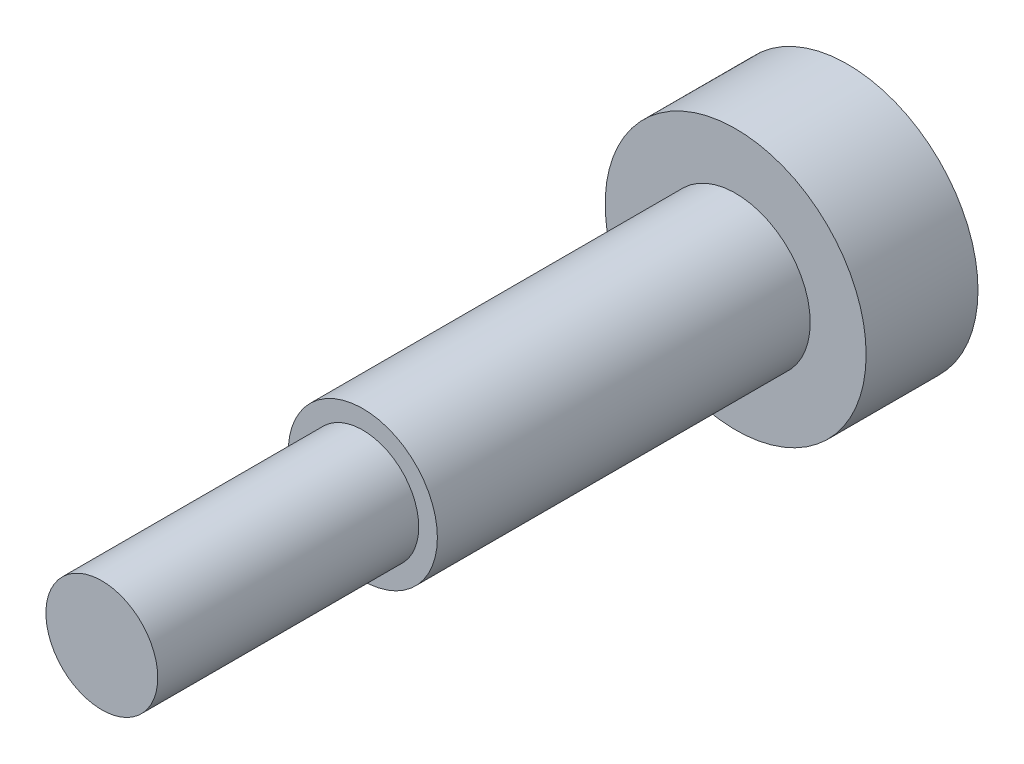
ISO-10303-21;
HEADER;
FILE_DESCRIPTION(('STEP AP214'),'2;1');
FILE_NAME('part.step','',(''),(''),'','','');
FILE_SCHEMA(('AUTOMOTIVE_DESIGN { 1 0 10303 214 1 1 1 1 }'));
ENDSEC;
DATA;
#1=APPLICATION_CONTEXT('core data for automotive mechanical design processes');
#2=APPLICATION_PROTOCOL_DEFINITION('international standard','automotive_design',2000,#1);
#3=PRODUCT_CONTEXT('',#1,'mechanical');
#4=PRODUCT('Part','Part','',(#3));
#5=PRODUCT_RELATED_PRODUCT_CATEGORY('part','',(#4));
#6=PRODUCT_DEFINITION_FORMATION('','',#4);
#7=PRODUCT_DEFINITION_CONTEXT('part definition',#1,'design');
#8=PRODUCT_DEFINITION('design','',#6,#7);
#9=PRODUCT_DEFINITION_SHAPE('','',#8);
#10=(LENGTH_UNIT() NAMED_UNIT(*) SI_UNIT(.MILLI.,.METRE.));
#11=(NAMED_UNIT(*) PLANE_ANGLE_UNIT() SI_UNIT($,.RADIAN.));
#12=(NAMED_UNIT(*) SI_UNIT($,.STERADIAN.) SOLID_ANGLE_UNIT());
#13=UNCERTAINTY_MEASURE_WITH_UNIT(LENGTH_MEASURE(1.E-05),#10,'distance_accuracy_value','');
#14=(GEOMETRIC_REPRESENTATION_CONTEXT(3) GLOBAL_UNCERTAINTY_ASSIGNED_CONTEXT((#13)) GLOBAL_UNIT_ASSIGNED_CONTEXT((#10,
#11,#12)) REPRESENTATION_CONTEXT('',''));
#15=CARTESIAN_POINT('',(0.,0.,0.));
#16=DIRECTION('',(0.,0.,1.));
#17=DIRECTION('',(1.,0.,0.));
#18=AXIS2_PLACEMENT_3D('',#15,#16,#17);
#19=CARTESIAN_POINT('',(0.,0.,-3.));
#20=DIRECTION('',(0.,0.,1.));
#21=DIRECTION('',(1.,0.,0.));
#22=AXIS2_PLACEMENT_3D('',#19,#20,#21);
#23=PLANE('',#22);
#24=CARTESIAN_POINT('',(0.,0.,-3.));
#25=DIRECTION('',(0.,0.,1.));
#26=DIRECTION('',(1.,0.,0.));
#27=AXIS2_PLACEMENT_3D('',#24,#25,#26);
#28=CIRCLE('',#27,3.5);
#29=CARTESIAN_POINT('',(3.5,0.,-3.));
#30=VERTEX_POINT('',#29);
#31=EDGE_CURVE('E121',#30,#30,#28,.T.);
#32=ORIENTED_EDGE('',*,*,#31,.F.);
#33=EDGE_LOOP('',(#32));
#34=FACE_BOUND('',#33,.T.);
#35=DIRECTION('',(-0.5,-0.866025403784439,0.));
#36=VECTOR('',#35,1.);
#37=CARTESIAN_POINT('',(0.866025403784439,-0.5,-3.));
#38=LINE('',#37,#36);
#39=CARTESIAN_POINT('',(1.15470053837925,0.,-3.));
#40=VERTEX_POINT('',#39);
#41=CARTESIAN_POINT('',(0.577350269189626,-1.,-3.));
#42=VERTEX_POINT('',#41);
#43=EDGE_CURVE('E11',#40,#42,#38,.T.);
#44=ORIENTED_EDGE('',*,*,#43,.F.);
#45=DIRECTION('',(0.5,-0.866025403784439,0.));
#46=VECTOR('',#45,1.);
#47=CARTESIAN_POINT('',(0.866025403784439,0.5,-3.));
#48=LINE('',#47,#46);
#49=CARTESIAN_POINT('',(0.577350269189626,1.,-3.));
#50=VERTEX_POINT('',#49);
#51=EDGE_CURVE('E50',#50,#40,#48,.T.);
#52=ORIENTED_EDGE('',*,*,#51,.F.);
#53=DIRECTION('',(1.,0.,0.));
#54=VECTOR('',#53,1.);
#55=CARTESIAN_POINT('',(0.,1.,-3.));
#56=LINE('',#55,#54);
#57=CARTESIAN_POINT('',(-0.577350269189626,1.,-3.));
#58=VERTEX_POINT('',#57);
#59=EDGE_CURVE('E140',#58,#50,#56,.T.);
#60=ORIENTED_EDGE('',*,*,#59,.F.);
#61=DIRECTION('',(0.5,0.866025403784438,0.));
#62=VECTOR('',#61,1.);
#63=CARTESIAN_POINT('',(-0.866025403784439,0.5,-3.));
#64=LINE('',#63,#62);
#65=CARTESIAN_POINT('',(-1.15470053837925,0.,-3.));
#66=VERTEX_POINT('',#65);
#67=EDGE_CURVE('E131',#66,#58,#64,.T.);
#68=ORIENTED_EDGE('',*,*,#67,.F.);
#69=DIRECTION('',(-0.5,0.866025403784439,0.));
#70=VECTOR('',#69,1.);
#71=CARTESIAN_POINT('',(-0.866025403784439,-0.5,-3.));
#72=LINE('',#71,#70);
#73=CARTESIAN_POINT('',(-0.577350269189626,-1.,-3.));
#74=VERTEX_POINT('',#73);
#75=EDGE_CURVE('E132',#74,#66,#72,.T.);
#76=ORIENTED_EDGE('',*,*,#75,.F.);
#77=DIRECTION('',(-1.,0.,0.));
#78=VECTOR('',#77,1.);
#79=CARTESIAN_POINT('',(0.,-1.,-3.));
#80=LINE('',#79,#78);
#81=EDGE_CURVE('E119',#42,#74,#80,.T.);
#82=ORIENTED_EDGE('',*,*,#81,.F.);
#83=EDGE_LOOP('',(#44,#52,#60,#68,#76,#82));
#84=FACE_BOUND('',#83,.T.);
#85=ADVANCED_FACE('F39',(#34,#84),#23,.F.);
#86=CARTESIAN_POINT('',(0.,0.,0.));
#87=DIRECTION('',(0.,0.,-1.));
#88=DIRECTION('',(-1.,0.,0.));
#89=AXIS2_PLACEMENT_3D('',#86,#87,#88);
#90=CYLINDRICAL_SURFACE('',#89,3.5);
#91=CARTESIAN_POINT('',(0.,0.,0.));
#92=DIRECTION('',(0.,0.,1.));
#93=DIRECTION('',(1.,0.,0.));
#94=AXIS2_PLACEMENT_3D('',#91,#92,#93);
#95=CIRCLE('',#94,3.5);
#96=CARTESIAN_POINT('',(3.5,0.,0.));
#97=VERTEX_POINT('',#96);
#98=EDGE_CURVE('E130',#97,#97,#95,.T.);
#99=ORIENTED_EDGE('',*,*,#98,.F.);
#100=EDGE_LOOP('',(#99));
#101=FACE_BOUND('',#100,.T.);
#102=ORIENTED_EDGE('',*,*,#31,.T.);
#103=EDGE_LOOP('',(#102));
#104=FACE_BOUND('',#103,.T.);
#105=ADVANCED_FACE('F41',(#101,#104),#90,.T.);
#106=CARTESIAN_POINT('',(0.,0.,0.));
#107=DIRECTION('',(0.,0.,1.));
#108=DIRECTION('',(1.,0.,0.));
#109=AXIS2_PLACEMENT_3D('',#106,#107,#108);
#110=PLANE('',#109);
#111=CARTESIAN_POINT('',(0.,0.,0.));
#112=DIRECTION('',(0.,0.,1.));
#113=DIRECTION('',(1.,0.,0.));
#114=AXIS2_PLACEMENT_3D('',#111,#112,#113);
#115=CIRCLE('',#114,2.);
#116=CARTESIAN_POINT('',(2.,0.,0.));
#117=VERTEX_POINT('',#116);
#118=EDGE_CURVE('E122',#117,#117,#115,.T.);
#119=ORIENTED_EDGE('',*,*,#118,.F.);
#120=EDGE_LOOP('',(#119));
#121=FACE_BOUND('',#120,.T.);
#122=ORIENTED_EDGE('',*,*,#98,.T.);
#123=EDGE_LOOP('',(#122));
#124=FACE_BOUND('',#123,.T.);
#125=ADVANCED_FACE('F183',(#121,#124),#110,.T.);
#126=CARTESIAN_POINT('',(0.,0.,10.));
#127=DIRECTION('',(0.,0.,-1.));
#128=DIRECTION('',(-1.,0.,0.));
#129=AXIS2_PLACEMENT_3D('',#126,#127,#128);
#130=CYLINDRICAL_SURFACE('',#129,2.);
#131=CARTESIAN_POINT('',(0.,0.,10.));
#132=DIRECTION('',(0.,0.,1.));
#133=DIRECTION('',(1.,0.,0.));
#134=AXIS2_PLACEMENT_3D('',#131,#132,#133);
#135=CIRCLE('',#134,2.);
#136=CARTESIAN_POINT('',(2.,0.,10.));
#137=VERTEX_POINT('',#136);
#138=EDGE_CURVE('E111',#137,#137,#135,.T.);
#139=ORIENTED_EDGE('',*,*,#138,.F.);
#140=EDGE_LOOP('',(#139));
#141=FACE_BOUND('',#140,.T.);
#142=ORIENTED_EDGE('',*,*,#118,.T.);
#143=EDGE_LOOP('',(#142));
#144=FACE_BOUND('',#143,.T.);
#145=ADVANCED_FACE('F188',(#141,#144),#130,.T.);
#146=CARTESIAN_POINT('',(0.,0.,10.));
#147=DIRECTION('',(0.,0.,1.));
#148=DIRECTION('',(1.,0.,0.));
#149=AXIS2_PLACEMENT_3D('',#146,#147,#148);
#150=PLANE('',#149);
#151=CARTESIAN_POINT('',(0.,0.,10.));
#152=DIRECTION('',(0.,0.,1.));
#153=DIRECTION('',(1.,0.,0.));
#154=AXIS2_PLACEMENT_3D('',#151,#152,#153);
#155=CIRCLE('',#154,1.5);
#156=CARTESIAN_POINT('',(1.5,0.,10.));
#157=VERTEX_POINT('',#156);
#158=EDGE_CURVE('E120',#157,#157,#155,.T.);
#159=ORIENTED_EDGE('',*,*,#158,.F.);
#160=EDGE_LOOP('',(#159));
#161=FACE_BOUND('',#160,.T.);
#162=ORIENTED_EDGE('',*,*,#138,.T.);
#163=EDGE_LOOP('',(#162));
#164=FACE_BOUND('',#163,.T.);
#165=ADVANCED_FACE('F191',(#161,#164),#150,.T.);
#166=CARTESIAN_POINT('',(0.,0.,17.));
#167=DIRECTION('',(0.,0.,-1.));
#168=DIRECTION('',(-1.,0.,0.));
#169=AXIS2_PLACEMENT_3D('',#166,#167,#168);
#170=CYLINDRICAL_SURFACE('',#169,1.5);
#171=CARTESIAN_POINT('',(0.,0.,17.));
#172=DIRECTION('',(0.,0.,1.));
#173=DIRECTION('',(1.,0.,0.));
#174=AXIS2_PLACEMENT_3D('',#171,#172,#173);
#175=CIRCLE('',#174,1.5);
#176=CARTESIAN_POINT('',(1.5,0.,17.));
#177=VERTEX_POINT('',#176);
#178=EDGE_CURVE('E110',#177,#177,#175,.T.);
#179=ORIENTED_EDGE('',*,*,#178,.F.);
#180=EDGE_LOOP('',(#179));
#181=FACE_BOUND('',#180,.T.);
#182=ORIENTED_EDGE('',*,*,#158,.T.);
#183=EDGE_LOOP('',(#182));
#184=FACE_BOUND('',#183,.T.);
#185=ADVANCED_FACE('F197',(#181,#184),#170,.T.);
#186=CARTESIAN_POINT('',(0.,0.,17.));
#187=DIRECTION('',(0.,0.,1.));
#188=DIRECTION('',(1.,0.,0.));
#189=AXIS2_PLACEMENT_3D('',#186,#187,#188);
#190=PLANE('',#189);
#191=ORIENTED_EDGE('',*,*,#178,.T.);
#192=EDGE_LOOP('',(#191));
#193=FACE_BOUND('',#192,.T.);
#194=ADVANCED_FACE('F205',(#193),#190,.T.);
#195=CARTESIAN_POINT('',(0.577350269189626,-1.,-0.96));
#196=DIRECTION('',(-0.866025403784439,0.5,0.));
#197=DIRECTION('',(-0.5,-0.866025403784439,0.));
#198=AXIS2_PLACEMENT_3D('',#195,#196,#197);
#199=PLANE('',#198);
#200=ORIENTED_EDGE('',*,*,#43,.T.);
#201=DIRECTION('',(0.,0.,-1.));
#202=VECTOR('',#201,1.);
#203=CARTESIAN_POINT('',(0.577350269189626,-1.,-0.96));
#204=LINE('',#203,#202);
#205=CARTESIAN_POINT('',(0.577350269189626,-1.,-0.96));
#206=VERTEX_POINT('',#205);
#207=EDGE_CURVE('E53',#206,#42,#204,.T.);
#208=ORIENTED_EDGE('',*,*,#207,.F.);
#209=DIRECTION('',(0.5,0.866025403784439,0.));
#210=VECTOR('',#209,1.);
#211=CARTESIAN_POINT('',(0.577350269189626,-1.,-0.96));
#212=LINE('',#211,#210);
#213=CARTESIAN_POINT('',(1.15470053837925,0.,-0.96));
#214=VERTEX_POINT('',#213);
#215=EDGE_CURVE('E98',#206,#214,#212,.T.);
#216=ORIENTED_EDGE('',*,*,#215,.T.);
#217=DIRECTION('',(0.,0.,-1.));
#218=VECTOR('',#217,1.);
#219=CARTESIAN_POINT('',(1.15470053837925,0.,-0.96));
#220=LINE('',#219,#218);
#221=EDGE_CURVE('E101',#214,#40,#220,.T.);
#222=ORIENTED_EDGE('',*,*,#221,.T.);
#223=EDGE_LOOP('',(#200,#208,#216,#222));
#224=FACE_BOUND('',#223,.T.);
#225=ADVANCED_FACE('F105',(#224),#199,.T.);
#226=CARTESIAN_POINT('',(1.15470053837925,0.,-0.96));
#227=DIRECTION('',(-0.866025403784439,-0.5,0.));
#228=DIRECTION('',(0.5,-0.866025403784439,0.));
#229=AXIS2_PLACEMENT_3D('',#226,#227,#228);
#230=PLANE('',#229);
#231=ORIENTED_EDGE('',*,*,#51,.T.);
#232=ORIENTED_EDGE('',*,*,#221,.F.);
#233=DIRECTION('',(-0.5,0.866025403784439,0.));
#234=VECTOR('',#233,1.);
#235=CARTESIAN_POINT('',(1.15470053837925,0.,-0.96));
#236=LINE('',#235,#234);
#237=CARTESIAN_POINT('',(0.577350269189626,1.,-0.96));
#238=VERTEX_POINT('',#237);
#239=EDGE_CURVE('E95',#214,#238,#236,.T.);
#240=ORIENTED_EDGE('',*,*,#239,.T.);
#241=DIRECTION('',(0.,0.,-1.));
#242=VECTOR('',#241,1.);
#243=CARTESIAN_POINT('',(0.577350269189626,1.,-0.96));
#244=LINE('',#243,#242);
#245=EDGE_CURVE('E108',#238,#50,#244,.T.);
#246=ORIENTED_EDGE('',*,*,#245,.T.);
#247=EDGE_LOOP('',(#231,#232,#240,#246));
#248=FACE_BOUND('',#247,.T.);
#249=ADVANCED_FACE('F106',(#248),#230,.T.);
#250=CARTESIAN_POINT('',(0.577350269189626,1.,-0.96));
#251=DIRECTION('',(0.,-1.,0.));
#252=DIRECTION('',(1.,0.,0.));
#253=AXIS2_PLACEMENT_3D('',#250,#251,#252);
#254=PLANE('',#253);
#255=ORIENTED_EDGE('',*,*,#59,.T.);
#256=ORIENTED_EDGE('',*,*,#245,.F.);
#257=DIRECTION('',(-1.,0.,0.));
#258=VECTOR('',#257,1.);
#259=CARTESIAN_POINT('',(0.577350269189626,1.,-0.96));
#260=LINE('',#259,#258);
#261=CARTESIAN_POINT('',(-0.577350269189626,1.,-0.96));
#262=VERTEX_POINT('',#261);
#263=EDGE_CURVE('E96',#238,#262,#260,.T.);
#264=ORIENTED_EDGE('',*,*,#263,.T.);
#265=DIRECTION('',(0.,0.,-1.));
#266=VECTOR('',#265,1.);
#267=CARTESIAN_POINT('',(-0.577350269189626,1.,-0.96));
#268=LINE('',#267,#266);
#269=EDGE_CURVE('E113',#262,#58,#268,.T.);
#270=ORIENTED_EDGE('',*,*,#269,.T.);
#271=EDGE_LOOP('',(#255,#256,#264,#270));
#272=FACE_BOUND('',#271,.T.);
#273=ADVANCED_FACE('F142',(#272),#254,.T.);
#274=CARTESIAN_POINT('',(-0.577350269189626,1.,-0.96));
#275=DIRECTION('',(0.866025403784438,-0.5,0.));
#276=DIRECTION('',(0.5,0.866025403784438,0.));
#277=AXIS2_PLACEMENT_3D('',#274,#275,#276);
#278=PLANE('',#277);
#279=ORIENTED_EDGE('',*,*,#67,.T.);
#280=ORIENTED_EDGE('',*,*,#269,.F.);
#281=DIRECTION('',(-0.5,-0.866025403784438,0.));
#282=VECTOR('',#281,1.);
#283=CARTESIAN_POINT('',(-0.577350269189626,1.,-0.96));
#284=LINE('',#283,#282);
#285=CARTESIAN_POINT('',(-1.15470053837925,0.,-0.96));
#286=VERTEX_POINT('',#285);
#287=EDGE_CURVE('E164',#262,#286,#284,.T.);
#288=ORIENTED_EDGE('',*,*,#287,.T.);
#289=DIRECTION('',(0.,0.,-1.));
#290=VECTOR('',#289,1.);
#291=CARTESIAN_POINT('',(-1.15470053837925,0.,-0.96));
#292=LINE('',#291,#290);
#293=EDGE_CURVE('E160',#286,#66,#292,.T.);
#294=ORIENTED_EDGE('',*,*,#293,.T.);
#295=EDGE_LOOP('',(#279,#280,#288,#294));
#296=FACE_BOUND('',#295,.T.);
#297=ADVANCED_FACE('F166',(#296),#278,.T.);
#298=CARTESIAN_POINT('',(-1.15470053837925,0.,-0.96));
#299=DIRECTION('',(0.866025403784439,0.5,0.));
#300=DIRECTION('',(-0.5,0.866025403784439,0.));
#301=AXIS2_PLACEMENT_3D('',#298,#299,#300);
#302=PLANE('',#301);
#303=ORIENTED_EDGE('',*,*,#75,.T.);
#304=ORIENTED_EDGE('',*,*,#293,.F.);
#305=DIRECTION('',(0.5,-0.866025403784439,0.));
#306=VECTOR('',#305,1.);
#307=CARTESIAN_POINT('',(-1.15470053837925,0.,-0.96));
#308=LINE('',#307,#306);
#309=CARTESIAN_POINT('',(-0.577350269189626,-1.,-0.96));
#310=VERTEX_POINT('',#309);
#311=EDGE_CURVE('E158',#286,#310,#308,.T.);
#312=ORIENTED_EDGE('',*,*,#311,.T.);
#313=DIRECTION('',(0.,0.,-1.));
#314=VECTOR('',#313,1.);
#315=CARTESIAN_POINT('',(-0.577350269189626,-1.,-0.96));
#316=LINE('',#315,#314);
#317=EDGE_CURVE('E148',#310,#74,#316,.T.);
#318=ORIENTED_EDGE('',*,*,#317,.T.);
#319=EDGE_LOOP('',(#303,#304,#312,#318));
#320=FACE_BOUND('',#319,.T.);
#321=ADVANCED_FACE('F154',(#320),#302,.T.);
#322=CARTESIAN_POINT('',(-0.577350269189626,-1.,-0.96));
#323=DIRECTION('',(0.,1.,0.));
#324=DIRECTION('',(-1.,0.,0.));
#325=AXIS2_PLACEMENT_3D('',#322,#323,#324);
#326=PLANE('',#325);
#327=ORIENTED_EDGE('',*,*,#81,.T.);
#328=ORIENTED_EDGE('',*,*,#317,.F.);
#329=DIRECTION('',(1.,0.,0.));
#330=VECTOR('',#329,1.);
#331=CARTESIAN_POINT('',(-0.577350269189626,-1.,-0.96));
#332=LINE('',#331,#330);
#333=EDGE_CURVE('E157',#310,#206,#332,.T.);
#334=ORIENTED_EDGE('',*,*,#333,.T.);
#335=ORIENTED_EDGE('',*,*,#207,.T.);
#336=EDGE_LOOP('',(#327,#328,#334,#335));
#337=FACE_BOUND('',#336,.T.);
#338=ADVANCED_FACE('F146',(#337),#326,.T.);
#339=CARTESIAN_POINT('',(0.,0.,-0.96));
#340=DIRECTION('',(0.,0.,1.));
#341=DIRECTION('',(1.,0.,0.));
#342=AXIS2_PLACEMENT_3D('',#339,#340,#341);
#343=PLANE('',#342);
#344=ORIENTED_EDGE('',*,*,#215,.F.);
#345=ORIENTED_EDGE('',*,*,#333,.F.);
#346=ORIENTED_EDGE('',*,*,#311,.F.);
#347=ORIENTED_EDGE('',*,*,#287,.F.);
#348=ORIENTED_EDGE('',*,*,#263,.F.);
#349=ORIENTED_EDGE('',*,*,#239,.F.);
#350=EDGE_LOOP('',(#344,#345,#346,#347,#348,#349));
#351=FACE_BOUND('',#350,.T.);
#352=ADVANCED_FACE('F94',(#351),#343,.F.);
#353=CLOSED_SHELL('',(#85,#105,#125,#145,#165,#185,#194,#225,#249,#273,#297,#321,#338,#352));
#354=MANIFOLD_SOLID_BREP('B2',#353);
#355=ADVANCED_BREP_SHAPE_REPRESENTATION('',(#18,#354),#14);
#356=SHAPE_DEFINITION_REPRESENTATION(#9,#355);
ENDSEC;
END-ISO-10303-21;
